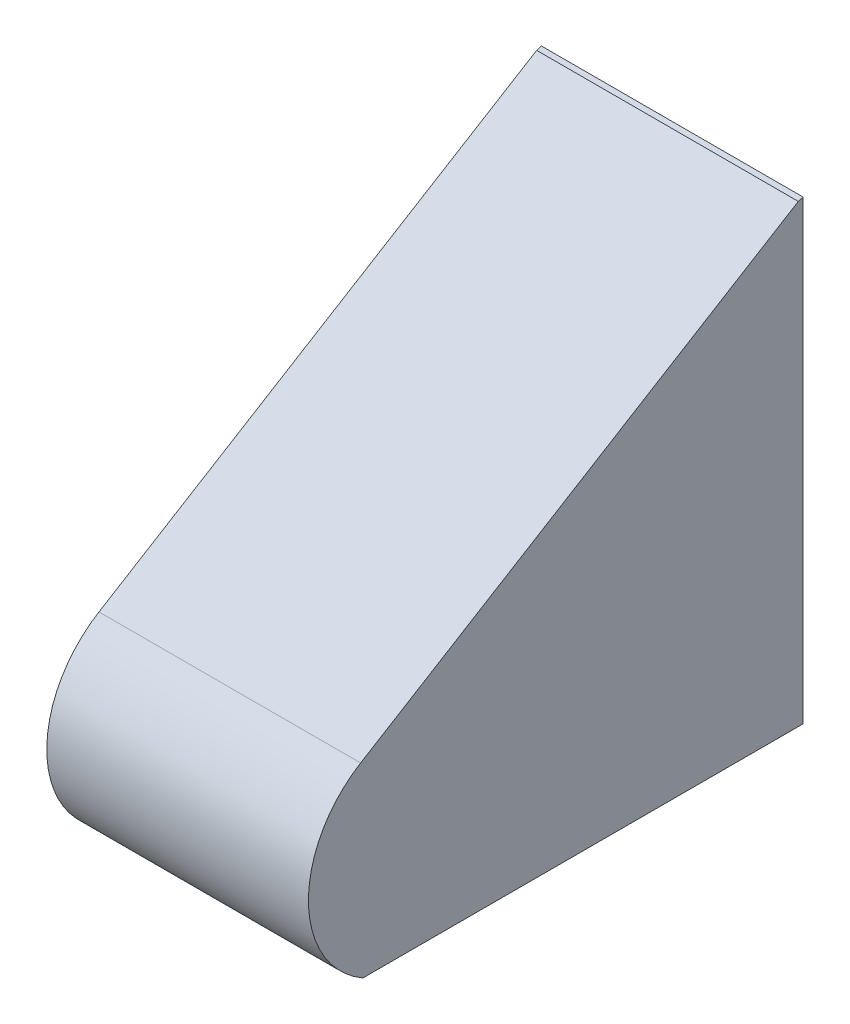
ISO-10303-21;
HEADER;
FILE_DESCRIPTION(('STEP AP214'),'2;1');
FILE_NAME('part.step','',(''),(''),'','','');
FILE_SCHEMA(('AUTOMOTIVE_DESIGN { 1 0 10303 214 1 1 1 1 }'));
ENDSEC;
DATA;
#1=APPLICATION_CONTEXT('core data for automotive mechanical design processes');
#2=APPLICATION_PROTOCOL_DEFINITION('international standard','automotive_design',2000,#1);
#3=PRODUCT_CONTEXT('',#1,'mechanical');
#4=PRODUCT('Part','Part','',(#3));
#5=PRODUCT_RELATED_PRODUCT_CATEGORY('part','',(#4));
#6=PRODUCT_DEFINITION_FORMATION('','',#4);
#7=PRODUCT_DEFINITION_CONTEXT('part definition',#1,'design');
#8=PRODUCT_DEFINITION('design','',#6,#7);
#9=PRODUCT_DEFINITION_SHAPE('','',#8);
#10=(LENGTH_UNIT() NAMED_UNIT(*) SI_UNIT(.MILLI.,.METRE.));
#11=(NAMED_UNIT(*) PLANE_ANGLE_UNIT() SI_UNIT($,.RADIAN.));
#12=(NAMED_UNIT(*) SI_UNIT($,.STERADIAN.) SOLID_ANGLE_UNIT());
#13=UNCERTAINTY_MEASURE_WITH_UNIT(LENGTH_MEASURE(1.E-05),#10,'distance_accuracy_value','');
#14=(GEOMETRIC_REPRESENTATION_CONTEXT(3) GLOBAL_UNCERTAINTY_ASSIGNED_CONTEXT((#13)) GLOBAL_UNIT_ASSIGNED_CONTEXT((#10,
#11,#12)) REPRESENTATION_CONTEXT('',''));
#15=CARTESIAN_POINT('',(0.,0.,0.));
#16=DIRECTION('',(0.,0.,1.));
#17=DIRECTION('',(1.,0.,0.));
#18=AXIS2_PLACEMENT_3D('',#15,#16,#17);
#19=CARTESIAN_POINT('',(-63.5,-119.126,0.));
#20=DIRECTION('',(0.,-1.,0.));
#21=DIRECTION('',(0.,0.,-1.));
#22=AXIS2_PLACEMENT_3D('',#19,#20,#21);
#23=PLANE('',#22);
#24=DIRECTION('',(1.,0.,0.));
#25=VECTOR('',#24,1.);
#26=CARTESIAN_POINT('',(-63.5,-119.126,0.));
#27=LINE('',#26,#25);
#28=CARTESIAN_POINT('',(-68.326,-119.126,0.));
#29=VERTEX_POINT('',#28);
#30=CARTESIAN_POINT('',(68.326,-119.126,0.));
#31=VERTEX_POINT('',#30);
#32=EDGE_CURVE('E11',#29,#31,#27,.T.);
#33=ORIENTED_EDGE('',*,*,#32,.T.);
#34=DIRECTION('',(0.,0.,-1.));
#35=VECTOR('',#34,1.);
#36=CARTESIAN_POINT('',(68.326,-119.126,229.92552978037));
#37=LINE('',#36,#35);
#38=CARTESIAN_POINT('',(68.326,-119.126,229.92552978037));
#39=VERTEX_POINT('',#38);
#40=EDGE_CURVE('E145',#39,#31,#37,.T.);
#41=ORIENTED_EDGE('',*,*,#40,.F.);
#42=DIRECTION('',(1.,0.,0.));
#43=VECTOR('',#42,1.);
#44=CARTESIAN_POINT('',(-63.5,-119.126,229.92552978037));
#45=LINE('',#44,#43);
#46=CARTESIAN_POINT('',(-68.326,-119.126,229.92552978037));
#47=VERTEX_POINT('',#46);
#48=EDGE_CURVE('E45',#47,#39,#45,.T.);
#49=ORIENTED_EDGE('',*,*,#48,.F.);
#50=DIRECTION('',(0.,0.,-1.));
#51=VECTOR('',#50,1.);
#52=CARTESIAN_POINT('',(-68.326,-119.126,229.92552978037));
#53=LINE('',#52,#51);
#54=EDGE_CURVE('E130',#47,#29,#53,.T.);
#55=ORIENTED_EDGE('',*,*,#54,.T.);
#56=EDGE_LOOP('',(#33,#41,#49,#55));
#57=FACE_BOUND('',#56,.T.);
#58=ADVANCED_FACE('F36',(#57),#23,.T.);
#59=CARTESIAN_POINT('',(-63.5,-69.85,201.436111111111));
#60=DIRECTION('',(1.,0.,0.));
#61=DIRECTION('',(0.,0.,-1.));
#62=AXIS2_PLACEMENT_3D('',#59,#60,#61);
#63=CYLINDRICAL_SURFACE('',#62,56.9189876237474);
#64=ORIENTED_EDGE('',*,*,#48,.T.);
#65=CARTESIAN_POINT('',(68.326,-69.85,201.436111111111));
#66=DIRECTION('',(1.,0.,0.));
#67=DIRECTION('',(0.,0.,-1.));
#68=AXIS2_PLACEMENT_3D('',#65,#66,#67);
#69=CIRCLE('',#68,56.9189876237474);
#70=CARTESIAN_POINT('',(68.326,-21.2820618707957,231.116517745625));
#71=VERTEX_POINT('',#70);
#72=EDGE_CURVE('E115',#71,#39,#69,.T.);
#73=ORIENTED_EDGE('',*,*,#72,.F.);
#74=DIRECTION('',(1.,0.,0.));
#75=VECTOR('',#74,1.);
#76=CARTESIAN_POINT('',(-63.5,-21.2820618707957,231.116517745625));
#77=LINE('',#76,#75);
#78=CARTESIAN_POINT('',(-68.326,-21.2820618707957,231.116517745625));
#79=VERTEX_POINT('',#78);
#80=EDGE_CURVE('E109',#79,#71,#77,.T.);
#81=ORIENTED_EDGE('',*,*,#80,.F.);
#82=CARTESIAN_POINT('',(-68.326,-69.85,201.436111111111));
#83=DIRECTION('',(1.,0.,0.));
#84=DIRECTION('',(0.,0.,-1.));
#85=AXIS2_PLACEMENT_3D('',#82,#83,#84);
#86=CIRCLE('',#85,56.9189876237474);
#87=EDGE_CURVE('E112',#79,#47,#86,.T.);
#88=ORIENTED_EDGE('',*,*,#87,.T.);
#89=EDGE_LOOP('',(#64,#73,#81,#88));
#90=FACE_BOUND('',#89,.T.);
#91=ADVANCED_FACE('F111',(#90),#63,.T.);
#92=CARTESIAN_POINT('',(-63.5,-21.2820618707957,231.116517745625));
#93=DIRECTION('',(0.,0.853281833651959,0.521450009453975));
#94=DIRECTION('',(0.,-0.521450009453975,0.853281833651959));
#95=AXIS2_PLACEMENT_3D('',#92,#93,#94);
#96=PLANE('',#95);
#97=ORIENTED_EDGE('',*,*,#80,.T.);
#98=DIRECTION('',(0.,-0.521450009453975,0.853281833651959));
#99=VECTOR('',#98,1.);
#100=CARTESIAN_POINT('',(68.326,118.417938129204,2.51651774562488));
#101=LINE('',#100,#99);
#102=CARTESIAN_POINT('',(68.326,118.417938129204,2.51651774562488));
#103=VERTEX_POINT('',#102);
#104=EDGE_CURVE('E154',#103,#71,#101,.T.);
#105=ORIENTED_EDGE('',*,*,#104,.F.);
#106=DIRECTION('',(1.,0.,0.));
#107=VECTOR('',#106,1.);
#108=CARTESIAN_POINT('',(-63.5,118.417938129204,2.51651774562488));
#109=LINE('',#108,#107);
#110=CARTESIAN_POINT('',(-68.326,118.417938129204,2.51651774562488));
#111=VERTEX_POINT('',#110);
#112=EDGE_CURVE('E120',#111,#103,#109,.T.);
#113=ORIENTED_EDGE('',*,*,#112,.F.);
#114=DIRECTION('',(0.,-0.521450009453975,0.853281833651959));
#115=VECTOR('',#114,1.);
#116=CARTESIAN_POINT('',(-68.326,118.417938129204,2.51651774562488));
#117=LINE('',#116,#115);
#118=EDGE_CURVE('E126',#111,#79,#117,.T.);
#119=ORIENTED_EDGE('',*,*,#118,.T.);
#120=EDGE_LOOP('',(#97,#105,#113,#119));
#121=FACE_BOUND('',#120,.T.);
#122=ADVANCED_FACE('F133',(#121),#96,.T.);
#123=CARTESIAN_POINT('',(-63.5,118.417938129204,2.51651774562488));
#124=DIRECTION('',(0.,0.962621897125756,0.270848819775925));
#125=DIRECTION('',(0.,-0.270848819775925,0.962621897125756));
#126=AXIS2_PLACEMENT_3D('',#123,#124,#125);
#127=PLANE('',#126);
#128=ORIENTED_EDGE('',*,*,#112,.T.);
#129=DIRECTION('',(0.,-0.270848819775925,0.962621897125756));
#130=VECTOR('',#129,1.);
#131=CARTESIAN_POINT('',(68.326,119.126,0.));
#132=LINE('',#131,#130);
#133=CARTESIAN_POINT('',(68.326,119.126,0.));
#134=VERTEX_POINT('',#133);
#135=EDGE_CURVE('E151',#134,#103,#132,.T.);
#136=ORIENTED_EDGE('',*,*,#135,.F.);
#137=DIRECTION('',(1.,0.,0.));
#138=VECTOR('',#137,1.);
#139=CARTESIAN_POINT('',(-63.5,119.126,0.));
#140=LINE('',#139,#138);
#141=CARTESIAN_POINT('',(-68.326,119.126,0.));
#142=VERTEX_POINT('',#141);
#143=EDGE_CURVE('E176',#142,#134,#140,.T.);
#144=ORIENTED_EDGE('',*,*,#143,.F.);
#145=DIRECTION('',(0.,-0.270848819775925,0.962621897125756));
#146=VECTOR('',#145,1.);
#147=CARTESIAN_POINT('',(-68.326,119.126,0.));
#148=LINE('',#147,#146);
#149=EDGE_CURVE('E134',#142,#111,#148,.T.);
#150=ORIENTED_EDGE('',*,*,#149,.T.);
#151=EDGE_LOOP('',(#128,#136,#144,#150));
#152=FACE_BOUND('',#151,.T.);
#153=ADVANCED_FACE('F214',(#152),#127,.T.);
#154=CARTESIAN_POINT('',(-63.5,114.3,0.));
#155=DIRECTION('',(0.,0.,-1.));
#156=DIRECTION('',(-1.,0.,0.));
#157=AXIS2_PLACEMENT_3D('',#154,#155,#156);
#158=PLANE('',#157);
#159=DIRECTION('',(0.,1.,0.));
#160=VECTOR('',#159,1.);
#161=CARTESIAN_POINT('',(-63.5,119.126,0.));
#162=LINE('',#161,#160);
#163=CARTESIAN_POINT('',(-63.5,-114.3,0.));
#164=VERTEX_POINT('',#163);
#165=CARTESIAN_POINT('',(-63.5,114.3,0.));
#166=VERTEX_POINT('',#165);
#167=EDGE_CURVE('E131',#164,#166,#162,.T.);
#168=ORIENTED_EDGE('',*,*,#167,.F.);
#169=DIRECTION('',(1.,0.,0.));
#170=VECTOR('',#169,1.);
#171=CARTESIAN_POINT('',(-63.5,-114.3,0.));
#172=LINE('',#171,#170);
#173=CARTESIAN_POINT('',(63.5,-114.3,0.));
#174=VERTEX_POINT('',#173);
#175=EDGE_CURVE('E40',#164,#174,#172,.T.);
#176=ORIENTED_EDGE('',*,*,#175,.T.);
#177=DIRECTION('',(0.,1.,0.));
#178=VECTOR('',#177,1.);
#179=CARTESIAN_POINT('',(63.5,119.126,0.));
#180=LINE('',#179,#178);
#181=CARTESIAN_POINT('',(63.5,114.3,0.));
#182=VERTEX_POINT('',#181);
#183=EDGE_CURVE('E142',#174,#182,#180,.T.);
#184=ORIENTED_EDGE('',*,*,#183,.T.);
#185=DIRECTION('',(1.,0.,0.));
#186=VECTOR('',#185,1.);
#187=CARTESIAN_POINT('',(-63.5,114.3,0.));
#188=LINE('',#187,#186);
#189=EDGE_CURVE('E178',#166,#182,#188,.T.);
#190=ORIENTED_EDGE('',*,*,#189,.F.);
#191=EDGE_LOOP('',(#168,#176,#184,#190));
#192=FACE_BOUND('',#191,.T.);
#193=ORIENTED_EDGE('',*,*,#143,.T.);
#194=DIRECTION('',(0.,1.,0.));
#195=VECTOR('',#194,1.);
#196=CARTESIAN_POINT('',(68.326,119.126,0.));
#197=LINE('',#196,#195);
#198=EDGE_CURVE('E148',#31,#134,#197,.T.);
#199=ORIENTED_EDGE('',*,*,#198,.F.);
#200=ORIENTED_EDGE('',*,*,#32,.F.);
#201=DIRECTION('',(0.,1.,0.));
#202=VECTOR('',#201,1.);
#203=CARTESIAN_POINT('',(-68.326,119.126,0.));
#204=LINE('',#203,#202);
#205=EDGE_CURVE('E136',#29,#142,#204,.T.);
#206=ORIENTED_EDGE('',*,*,#205,.T.);
#207=EDGE_LOOP('',(#193,#199,#200,#206));
#208=FACE_BOUND('',#207,.T.);
#209=ADVANCED_FACE('F186',(#192,#208),#158,.T.);
#210=CARTESIAN_POINT('',(-63.5,-25.4,228.6));
#211=DIRECTION('',(0.,-0.853281833651959,-0.521450009453975));
#212=DIRECTION('',(0.,0.521450009453975,-0.853281833651959));
#213=AXIS2_PLACEMENT_3D('',#210,#211,#212);
#214=PLANE('',#213);
#215=ORIENTED_EDGE('',*,*,#189,.T.);
#216=DIRECTION('',(0.,0.521450009453975,-0.853281833651959));
#217=VECTOR('',#216,1.);
#218=CARTESIAN_POINT('',(63.5,-25.4,228.6));
#219=LINE('',#218,#217);
#220=CARTESIAN_POINT('',(63.5,-25.4,228.6));
#221=VERTEX_POINT('',#220);
#222=EDGE_CURVE('E164',#221,#182,#219,.T.);
#223=ORIENTED_EDGE('',*,*,#222,.F.);
#224=DIRECTION('',(1.,0.,0.));
#225=VECTOR('',#224,1.);
#226=CARTESIAN_POINT('',(-63.5,-25.4,228.6));
#227=LINE('',#226,#225);
#228=CARTESIAN_POINT('',(-63.5,-25.4,228.6));
#229=VERTEX_POINT('',#228);
#230=EDGE_CURVE('E60',#229,#221,#227,.T.);
#231=ORIENTED_EDGE('',*,*,#230,.F.);
#232=DIRECTION('',(0.,0.521450009453975,-0.853281833651959));
#233=VECTOR('',#232,1.);
#234=CARTESIAN_POINT('',(-63.5,-25.4,228.6));
#235=LINE('',#234,#233);
#236=EDGE_CURVE('E171',#229,#166,#235,.T.);
#237=ORIENTED_EDGE('',*,*,#236,.T.);
#238=EDGE_LOOP('',(#215,#223,#231,#237));
#239=FACE_BOUND('',#238,.T.);
#240=ADVANCED_FACE('F193',(#239),#214,.T.);
#241=CARTESIAN_POINT('',(-63.5,-69.85,201.436111111111));
#242=DIRECTION('',(1.,0.,0.));
#243=DIRECTION('',(0.,0.,-1.));
#244=AXIS2_PLACEMENT_3D('',#241,#242,#243);
#245=CYLINDRICAL_SURFACE('',#244,52.0929876237474);
#246=ORIENTED_EDGE('',*,*,#230,.T.);
#247=CARTESIAN_POINT('',(63.5,-69.85,201.436111111111));
#248=DIRECTION('',(-1.,0.,0.));
#249=DIRECTION('',(0.,0.,-1.));
#250=AXIS2_PLACEMENT_3D('',#247,#248,#249);
#251=CIRCLE('',#250,52.0929876237474);
#252=CARTESIAN_POINT('',(63.5,-114.3,228.6));
#253=VERTEX_POINT('',#252);
#254=EDGE_CURVE('E161',#253,#221,#251,.T.);
#255=ORIENTED_EDGE('',*,*,#254,.F.);
#256=DIRECTION('',(1.,0.,0.));
#257=VECTOR('',#256,1.);
#258=CARTESIAN_POINT('',(-63.5,-114.3,228.6));
#259=LINE('',#258,#257);
#260=CARTESIAN_POINT('',(-63.5,-114.3,228.6));
#261=VERTEX_POINT('',#260);
#262=EDGE_CURVE('E180',#261,#253,#259,.T.);
#263=ORIENTED_EDGE('',*,*,#262,.F.);
#264=CARTESIAN_POINT('',(-63.5,-69.85,201.436111111111));
#265=DIRECTION('',(-1.,0.,0.));
#266=DIRECTION('',(0.,0.,-1.));
#267=AXIS2_PLACEMENT_3D('',#264,#265,#266);
#268=CIRCLE('',#267,52.0929876237474);
#269=EDGE_CURVE('E53',#261,#229,#268,.T.);
#270=ORIENTED_EDGE('',*,*,#269,.T.);
#271=EDGE_LOOP('',(#246,#255,#263,#270));
#272=FACE_BOUND('',#271,.T.);
#273=ADVANCED_FACE('F221',(#272),#245,.F.);
#274=CARTESIAN_POINT('',(-63.5,-114.3,0.));
#275=DIRECTION('',(0.,1.,0.));
#276=DIRECTION('',(0.,0.,1.));
#277=AXIS2_PLACEMENT_3D('',#274,#275,#276);
#278=PLANE('',#277);
#279=ORIENTED_EDGE('',*,*,#262,.T.);
#280=DIRECTION('',(0.,0.,1.));
#281=VECTOR('',#280,1.);
#282=CARTESIAN_POINT('',(63.5,-114.3,0.));
#283=LINE('',#282,#281);
#284=EDGE_CURVE('E156',#174,#253,#283,.T.);
#285=ORIENTED_EDGE('',*,*,#284,.F.);
#286=ORIENTED_EDGE('',*,*,#175,.F.);
#287=DIRECTION('',(0.,0.,1.));
#288=VECTOR('',#287,1.);
#289=CARTESIAN_POINT('',(-63.5,-114.3,0.));
#290=LINE('',#289,#288);
#291=EDGE_CURVE('E167',#164,#261,#290,.T.);
#292=ORIENTED_EDGE('',*,*,#291,.T.);
#293=EDGE_LOOP('',(#279,#285,#286,#292));
#294=FACE_BOUND('',#293,.T.);
#295=ADVANCED_FACE('F38',(#294),#278,.T.);
#296=CARTESIAN_POINT('',(63.5,-69.85,201.436111111111));
#297=DIRECTION('',(1.,0.,0.));
#298=DIRECTION('',(0.,0.,-1.));
#299=AXIS2_PLACEMENT_3D('',#296,#297,#298);
#300=PLANE('',#299);
#301=ORIENTED_EDGE('',*,*,#183,.F.);
#302=ORIENTED_EDGE('',*,*,#284,.T.);
#303=ORIENTED_EDGE('',*,*,#254,.T.);
#304=ORIENTED_EDGE('',*,*,#222,.T.);
#305=EDGE_LOOP('',(#301,#302,#303,#304));
#306=FACE_BOUND('',#305,.T.);
#307=ADVANCED_FACE('F191',(#306),#300,.F.);
#308=CARTESIAN_POINT('',(68.326,-69.85,201.436111111111));
#309=DIRECTION('',(1.,0.,0.));
#310=DIRECTION('',(0.,0.,-1.));
#311=AXIS2_PLACEMENT_3D('',#308,#309,#310);
#312=PLANE('',#311);
#313=ORIENTED_EDGE('',*,*,#72,.T.);
#314=ORIENTED_EDGE('',*,*,#40,.T.);
#315=ORIENTED_EDGE('',*,*,#198,.T.);
#316=ORIENTED_EDGE('',*,*,#135,.T.);
#317=ORIENTED_EDGE('',*,*,#104,.T.);
#318=EDGE_LOOP('',(#313,#314,#315,#316,#317));
#319=FACE_BOUND('',#318,.T.);
#320=ADVANCED_FACE('F200',(#319),#312,.T.);
#321=CARTESIAN_POINT('',(-68.326,-69.85,201.436111111111));
#322=DIRECTION('',(-1.,0.,0.));
#323=DIRECTION('',(0.,0.,-1.));
#324=AXIS2_PLACEMENT_3D('',#321,#322,#323);
#325=PLANE('',#324);
#326=ORIENTED_EDGE('',*,*,#87,.F.);
#327=ORIENTED_EDGE('',*,*,#118,.F.);
#328=ORIENTED_EDGE('',*,*,#149,.F.);
#329=ORIENTED_EDGE('',*,*,#205,.F.);
#330=ORIENTED_EDGE('',*,*,#54,.F.);
#331=EDGE_LOOP('',(#326,#327,#328,#329,#330));
#332=FACE_BOUND('',#331,.T.);
#333=ADVANCED_FACE('F124',(#332),#325,.T.);
#334=CARTESIAN_POINT('',(-63.5,-69.85,201.436111111111));
#335=DIRECTION('',(-1.,0.,0.));
#336=DIRECTION('',(0.,0.,-1.));
#337=AXIS2_PLACEMENT_3D('',#334,#335,#336);
#338=PLANE('',#337);
#339=ORIENTED_EDGE('',*,*,#236,.F.);
#340=ORIENTED_EDGE('',*,*,#269,.F.);
#341=ORIENTED_EDGE('',*,*,#291,.F.);
#342=ORIENTED_EDGE('',*,*,#167,.T.);
#343=EDGE_LOOP('',(#339,#340,#341,#342));
#344=FACE_BOUND('',#343,.T.);
#345=ADVANCED_FACE('F194',(#344),#338,.F.);
#346=CLOSED_SHELL('',(#58,#91,#122,#153,#209,#240,#273,#295,#307,#320,#333,#345));
#347=MANIFOLD_SOLID_BREP('B2',#346);
#348=ADVANCED_BREP_SHAPE_REPRESENTATION('',(#18,#347),#14);
#349=SHAPE_DEFINITION_REPRESENTATION(#9,#348);
ENDSEC;
END-ISO-10303-21;
